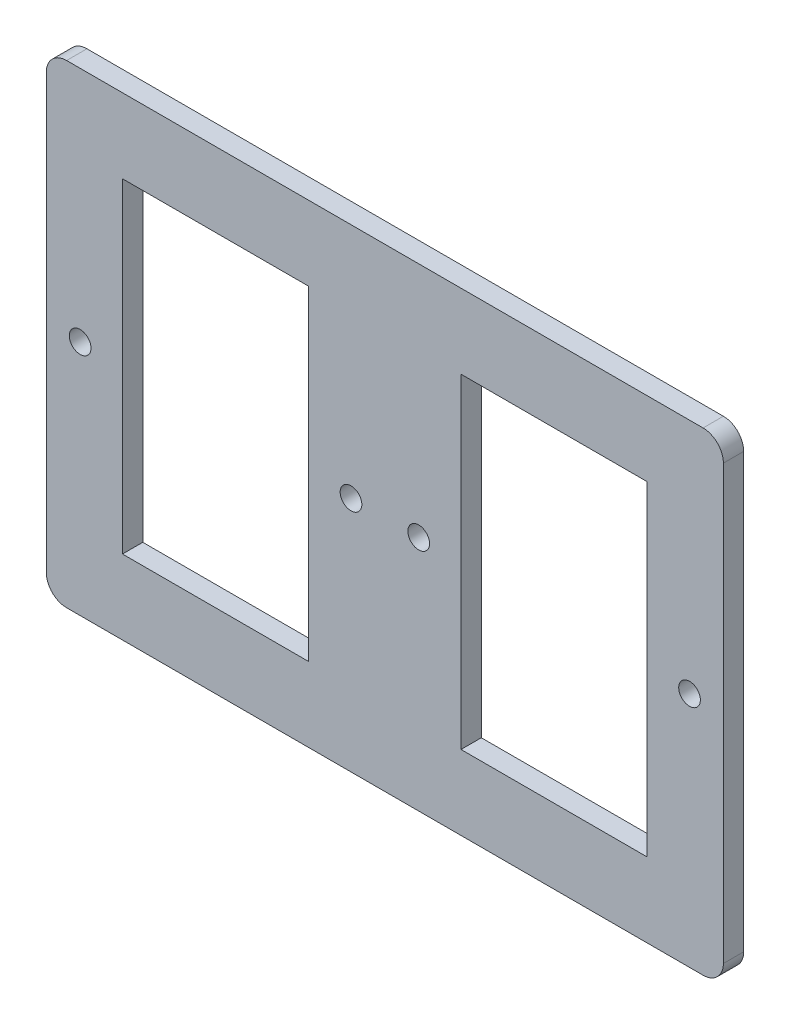
ISO-10303-21;
HEADER;
FILE_DESCRIPTION(('STEP AP214'),'2;1');
FILE_NAME('part.step','',(''),(''),'','','');
FILE_SCHEMA(('AUTOMOTIVE_DESIGN { 1 0 10303 214 1 1 1 1 }'));
ENDSEC;
DATA;
#1=APPLICATION_CONTEXT('core data for automotive mechanical design processes');
#2=APPLICATION_PROTOCOL_DEFINITION('international standard','automotive_design',2000,#1);
#3=PRODUCT_CONTEXT('',#1,'mechanical');
#4=PRODUCT('Part','Part','',(#3));
#5=PRODUCT_RELATED_PRODUCT_CATEGORY('part','',(#4));
#6=PRODUCT_DEFINITION_FORMATION('','',#4);
#7=PRODUCT_DEFINITION_CONTEXT('part definition',#1,'design');
#8=PRODUCT_DEFINITION('design','',#6,#7);
#9=PRODUCT_DEFINITION_SHAPE('','',#8);
#10=(LENGTH_UNIT() NAMED_UNIT(*) SI_UNIT(.MILLI.,.METRE.));
#11=(NAMED_UNIT(*) PLANE_ANGLE_UNIT() SI_UNIT($,.RADIAN.));
#12=(NAMED_UNIT(*) SI_UNIT($,.STERADIAN.) SOLID_ANGLE_UNIT());
#13=UNCERTAINTY_MEASURE_WITH_UNIT(LENGTH_MEASURE(1.E-05),#10,'distance_accuracy_value','');
#14=(GEOMETRIC_REPRESENTATION_CONTEXT(3) GLOBAL_UNCERTAINTY_ASSIGNED_CONTEXT((#13)) GLOBAL_UNIT_ASSIGNED_CONTEXT((#10,
#11,#12)) REPRESENTATION_CONTEXT('',''));
#15=CARTESIAN_POINT('',(0.,0.,0.));
#16=DIRECTION('',(0.,0.,1.));
#17=DIRECTION('',(1.,0.,0.));
#18=AXIS2_PLACEMENT_3D('',#15,#16,#17);
#19=CARTESIAN_POINT('',(0.,0.,3.));
#20=DIRECTION('',(0.,0.,1.));
#21=DIRECTION('',(1.,0.,0.));
#22=AXIS2_PLACEMENT_3D('',#19,#20,#21);
#23=PLANE('',#22);
#24=CARTESIAN_POINT('',(-45.,0.,3.));
#25=DIRECTION('',(0.,0.,1.));
#26=DIRECTION('',(1.,0.,0.));
#27=AXIS2_PLACEMENT_3D('',#24,#25,#26);
#28=CIRCLE('',#27,1.6);
#29=CARTESIAN_POINT('',(-43.4,0.,3.));
#30=VERTEX_POINT('',#29);
#31=EDGE_CURVE('E588',#30,#30,#28,.T.);
#32=ORIENTED_EDGE('',*,*,#31,.F.);
#33=EDGE_LOOP('',(#32));
#34=FACE_BOUND('',#33,.T.);
#35=CARTESIAN_POINT('',(-5.,0.,3.));
#36=DIRECTION('',(0.,0.,1.));
#37=DIRECTION('',(1.,0.,0.));
#38=AXIS2_PLACEMENT_3D('',#35,#36,#37);
#39=CIRCLE('',#38,1.6);
#40=CARTESIAN_POINT('',(-3.40000000000001,0.,3.));
#41=VERTEX_POINT('',#40);
#42=EDGE_CURVE('E582',#41,#41,#39,.T.);
#43=ORIENTED_EDGE('',*,*,#42,.F.);
#44=EDGE_LOOP('',(#43));
#45=FACE_BOUND('',#44,.T.);
#46=CARTESIAN_POINT('',(45.,0.,3.));
#47=DIRECTION('',(0.,0.,1.));
#48=DIRECTION('',(1.,0.,0.));
#49=AXIS2_PLACEMENT_3D('',#46,#47,#48);
#50=CIRCLE('',#49,1.6);
#51=CARTESIAN_POINT('',(46.6,0.,3.));
#52=VERTEX_POINT('',#51);
#53=EDGE_CURVE('E574',#52,#52,#50,.T.);
#54=ORIENTED_EDGE('',*,*,#53,.F.);
#55=EDGE_LOOP('',(#54));
#56=FACE_BOUND('',#55,.T.);
#57=CARTESIAN_POINT('',(5.,0.,3.));
#58=DIRECTION('',(0.,0.,1.));
#59=DIRECTION('',(1.,0.,0.));
#60=AXIS2_PLACEMENT_3D('',#57,#58,#59);
#61=CIRCLE('',#60,1.6);
#62=CARTESIAN_POINT('',(6.6,0.,3.));
#63=VERTEX_POINT('',#62);
#64=EDGE_CURVE('E569',#63,#63,#61,.T.);
#65=ORIENTED_EDGE('',*,*,#64,.F.);
#66=EDGE_LOOP('',(#65));
#67=FACE_BOUND('',#66,.T.);
#68=DIRECTION('',(0.,1.,0.));
#69=VECTOR('',#68,1.);
#70=CARTESIAN_POINT('',(50.,-35.,3.));
#71=LINE('',#70,#69);
#72=CARTESIAN_POINT('',(50.,-32.,3.));
#73=VERTEX_POINT('',#72);
#74=CARTESIAN_POINT('',(50.,32.,3.));
#75=VERTEX_POINT('',#74);
#76=EDGE_CURVE('E231',#73,#75,#71,.T.);
#77=ORIENTED_EDGE('',*,*,#76,.T.);
#78=CARTESIAN_POINT('',(47.,32.,3.));
#79=DIRECTION('',(0.,0.,1.));
#80=DIRECTION('',(1.,0.,0.));
#81=AXIS2_PLACEMENT_3D('',#78,#79,#80);
#82=CIRCLE('',#81,3.);
#83=CARTESIAN_POINT('',(47.,35.,3.));
#84=VERTEX_POINT('',#83);
#85=EDGE_CURVE('E269',#75,#84,#82,.T.);
#86=ORIENTED_EDGE('',*,*,#85,.T.);
#87=DIRECTION('',(-1.,0.,0.));
#88=VECTOR('',#87,1.);
#89=CARTESIAN_POINT('',(50.,35.,3.));
#90=LINE('',#89,#88);
#91=CARTESIAN_POINT('',(-47.,35.,3.));
#92=VERTEX_POINT('',#91);
#93=EDGE_CURVE('E234',#84,#92,#90,.T.);
#94=ORIENTED_EDGE('',*,*,#93,.T.);
#95=CARTESIAN_POINT('',(-47.,32.,3.));
#96=DIRECTION('',(0.,0.,1.));
#97=DIRECTION('',(1.,0.,0.));
#98=AXIS2_PLACEMENT_3D('',#95,#96,#97);
#99=CIRCLE('',#98,3.);
#100=CARTESIAN_POINT('',(-50.,32.,3.));
#101=VERTEX_POINT('',#100);
#102=EDGE_CURVE('E264',#92,#101,#99,.T.);
#103=ORIENTED_EDGE('',*,*,#102,.T.);
#104=DIRECTION('',(0.,-1.,0.));
#105=VECTOR('',#104,1.);
#106=CARTESIAN_POINT('',(-50.,-35.,3.));
#107=LINE('',#106,#105);
#108=CARTESIAN_POINT('',(-50.,-32.,3.));
#109=VERTEX_POINT('',#108);
#110=EDGE_CURVE('E226',#101,#109,#107,.T.);
#111=ORIENTED_EDGE('',*,*,#110,.T.);
#112=CARTESIAN_POINT('',(-47.,-32.,3.));
#113=DIRECTION('',(0.,0.,1.));
#114=DIRECTION('',(1.,0.,0.));
#115=AXIS2_PLACEMENT_3D('',#112,#113,#114);
#116=CIRCLE('',#115,3.);
#117=CARTESIAN_POINT('',(-47.,-35.,3.));
#118=VERTEX_POINT('',#117);
#119=EDGE_CURVE('E59',#109,#118,#116,.T.);
#120=ORIENTED_EDGE('',*,*,#119,.T.);
#121=DIRECTION('',(1.,0.,0.));
#122=VECTOR('',#121,1.);
#123=CARTESIAN_POINT('',(50.,-35.,3.));
#124=LINE('',#123,#122);
#125=CARTESIAN_POINT('',(47.,-35.,3.));
#126=VERTEX_POINT('',#125);
#127=EDGE_CURVE('E228',#118,#126,#124,.T.);
#128=ORIENTED_EDGE('',*,*,#127,.T.);
#129=CARTESIAN_POINT('',(47.,-32.,3.));
#130=DIRECTION('',(0.,0.,1.));
#131=DIRECTION('',(1.,0.,0.));
#132=AXIS2_PLACEMENT_3D('',#129,#130,#131);
#133=CIRCLE('',#132,3.);
#134=EDGE_CURVE('E267',#126,#73,#133,.T.);
#135=ORIENTED_EDGE('',*,*,#134,.T.);
#136=EDGE_LOOP('',(#77,#86,#94,#103,#111,#120,#128,#135));
#137=FACE_BOUND('',#136,.T.);
#138=DIRECTION('',(1.,0.,0.));
#139=VECTOR('',#138,1.);
#140=CARTESIAN_POINT('',(-11.25,-24.,3.));
#141=LINE('',#140,#139);
#142=CARTESIAN_POINT('',(-38.75,-24.,3.));
#143=VERTEX_POINT('',#142);
#144=CARTESIAN_POINT('',(-11.25,-24.,3.));
#145=VERTEX_POINT('',#144);
#146=EDGE_CURVE('E197',#143,#145,#141,.T.);
#147=ORIENTED_EDGE('',*,*,#146,.F.);
#148=DIRECTION('',(0.,-1.,0.));
#149=VECTOR('',#148,1.);
#150=CARTESIAN_POINT('',(-38.75,-24.,3.));
#151=LINE('',#150,#149);
#152=CARTESIAN_POINT('',(-38.75,24.,3.));
#153=VERTEX_POINT('',#152);
#154=EDGE_CURVE('E195',#153,#143,#151,.T.);
#155=ORIENTED_EDGE('',*,*,#154,.F.);
#156=DIRECTION('',(-1.,0.,0.));
#157=VECTOR('',#156,1.);
#158=CARTESIAN_POINT('',(-11.25,24.,3.));
#159=LINE('',#158,#157);
#160=CARTESIAN_POINT('',(-11.25,24.,3.));
#161=VERTEX_POINT('',#160);
#162=EDGE_CURVE('E203',#161,#153,#159,.T.);
#163=ORIENTED_EDGE('',*,*,#162,.F.);
#164=DIRECTION('',(0.,1.,0.));
#165=VECTOR('',#164,1.);
#166=CARTESIAN_POINT('',(-11.25,-24.,3.));
#167=LINE('',#166,#165);
#168=EDGE_CURVE('E200',#145,#161,#167,.T.);
#169=ORIENTED_EDGE('',*,*,#168,.F.);
#170=EDGE_LOOP('',(#147,#155,#163,#169));
#171=FACE_BOUND('',#170,.T.);
#172=DIRECTION('',(1.,0.,0.));
#173=VECTOR('',#172,1.);
#174=CARTESIAN_POINT('',(11.25,-24.,3.));
#175=LINE('',#174,#173);
#176=CARTESIAN_POINT('',(11.25,-24.,3.));
#177=VERTEX_POINT('',#176);
#178=CARTESIAN_POINT('',(38.75,-24.,3.));
#179=VERTEX_POINT('',#178);
#180=EDGE_CURVE('E162',#177,#179,#175,.T.);
#181=ORIENTED_EDGE('',*,*,#180,.F.);
#182=DIRECTION('',(0.,-1.,0.));
#183=VECTOR('',#182,1.);
#184=CARTESIAN_POINT('',(11.25,-24.,3.));
#185=LINE('',#184,#183);
#186=CARTESIAN_POINT('',(11.25,24.,3.));
#187=VERTEX_POINT('',#186);
#188=EDGE_CURVE('E152',#187,#177,#185,.T.);
#189=ORIENTED_EDGE('',*,*,#188,.F.);
#190=DIRECTION('',(-1.,0.,0.));
#191=VECTOR('',#190,1.);
#192=CARTESIAN_POINT('',(11.25,24.,3.));
#193=LINE('',#192,#191);
#194=CARTESIAN_POINT('',(38.75,24.,3.));
#195=VERTEX_POINT('',#194);
#196=EDGE_CURVE('E177',#195,#187,#193,.T.);
#197=ORIENTED_EDGE('',*,*,#196,.F.);
#198=DIRECTION('',(0.,1.,0.));
#199=VECTOR('',#198,1.);
#200=CARTESIAN_POINT('',(38.75,-24.,3.));
#201=LINE('',#200,#199);
#202=EDGE_CURVE('E175',#179,#195,#201,.T.);
#203=ORIENTED_EDGE('',*,*,#202,.F.);
#204=EDGE_LOOP('',(#181,#189,#197,#203));
#205=FACE_BOUND('',#204,.T.);
#206=ADVANCED_FACE('F37',(#34,#45,#56,#67,#137,#171,#205),#23,.T.);
#207=CARTESIAN_POINT('',(0.,0.,0.));
#208=DIRECTION('',(0.,0.,1.));
#209=DIRECTION('',(1.,0.,0.));
#210=AXIS2_PLACEMENT_3D('',#207,#208,#209);
#211=PLANE('',#210);
#212=CARTESIAN_POINT('',(-45.,0.,0.));
#213=DIRECTION('',(0.,0.,1.));
#214=DIRECTION('',(1.,0.,0.));
#215=AXIS2_PLACEMENT_3D('',#212,#213,#214);
#216=CIRCLE('',#215,1.6);
#217=CARTESIAN_POINT('',(-43.4,0.,0.));
#218=VERTEX_POINT('',#217);
#219=EDGE_CURVE('E585',#218,#218,#216,.T.);
#220=ORIENTED_EDGE('',*,*,#219,.T.);
#221=EDGE_LOOP('',(#220));
#222=FACE_BOUND('',#221,.T.);
#223=CARTESIAN_POINT('',(-5.,0.,0.));
#224=DIRECTION('',(0.,0.,1.));
#225=DIRECTION('',(1.,0.,0.));
#226=AXIS2_PLACEMENT_3D('',#223,#224,#225);
#227=CIRCLE('',#226,1.6);
#228=CARTESIAN_POINT('',(-3.40000000000001,0.,0.));
#229=VERTEX_POINT('',#228);
#230=EDGE_CURVE('E579',#229,#229,#227,.T.);
#231=ORIENTED_EDGE('',*,*,#230,.T.);
#232=EDGE_LOOP('',(#231));
#233=FACE_BOUND('',#232,.T.);
#234=CARTESIAN_POINT('',(45.,0.,0.));
#235=DIRECTION('',(0.,0.,1.));
#236=DIRECTION('',(1.,0.,0.));
#237=AXIS2_PLACEMENT_3D('',#234,#235,#236);
#238=CIRCLE('',#237,1.6);
#239=CARTESIAN_POINT('',(46.6,0.,0.));
#240=VERTEX_POINT('',#239);
#241=EDGE_CURVE('E571',#240,#240,#238,.T.);
#242=ORIENTED_EDGE('',*,*,#241,.T.);
#243=EDGE_LOOP('',(#242));
#244=FACE_BOUND('',#243,.T.);
#245=CARTESIAN_POINT('',(5.,0.,0.));
#246=DIRECTION('',(0.,0.,1.));
#247=DIRECTION('',(1.,0.,0.));
#248=AXIS2_PLACEMENT_3D('',#245,#246,#247);
#249=CIRCLE('',#248,1.6);
#250=CARTESIAN_POINT('',(6.6,0.,0.));
#251=VERTEX_POINT('',#250);
#252=EDGE_CURVE('E184',#251,#251,#249,.T.);
#253=ORIENTED_EDGE('',*,*,#252,.T.);
#254=EDGE_LOOP('',(#253));
#255=FACE_BOUND('',#254,.T.);
#256=DIRECTION('',(0.,-1.,0.));
#257=VECTOR('',#256,1.);
#258=CARTESIAN_POINT('',(-38.75,-24.,0.));
#259=LINE('',#258,#257);
#260=CARTESIAN_POINT('',(-38.75,24.,0.));
#261=VERTEX_POINT('',#260);
#262=CARTESIAN_POINT('',(-38.75,-24.,0.));
#263=VERTEX_POINT('',#262);
#264=EDGE_CURVE('E170',#261,#263,#259,.T.);
#265=ORIENTED_EDGE('',*,*,#264,.T.);
#266=DIRECTION('',(1.,0.,0.));
#267=VECTOR('',#266,1.);
#268=CARTESIAN_POINT('',(-11.25,-24.,0.));
#269=LINE('',#268,#267);
#270=CARTESIAN_POINT('',(-11.25,-24.,0.));
#271=VERTEX_POINT('',#270);
#272=EDGE_CURVE('E208',#263,#271,#269,.T.);
#273=ORIENTED_EDGE('',*,*,#272,.T.);
#274=DIRECTION('',(0.,1.,0.));
#275=VECTOR('',#274,1.);
#276=CARTESIAN_POINT('',(-11.25,-24.,0.));
#277=LINE('',#276,#275);
#278=CARTESIAN_POINT('',(-11.25,24.,0.));
#279=VERTEX_POINT('',#278);
#280=EDGE_CURVE('E211',#271,#279,#277,.T.);
#281=ORIENTED_EDGE('',*,*,#280,.T.);
#282=DIRECTION('',(-1.,0.,0.));
#283=VECTOR('',#282,1.);
#284=CARTESIAN_POINT('',(-11.25,24.,0.));
#285=LINE('',#284,#283);
#286=EDGE_CURVE('E198',#279,#261,#285,.T.);
#287=ORIENTED_EDGE('',*,*,#286,.T.);
#288=EDGE_LOOP('',(#265,#273,#281,#287));
#289=FACE_BOUND('',#288,.T.);
#290=DIRECTION('',(-1.,0.,0.));
#291=VECTOR('',#290,1.);
#292=CARTESIAN_POINT('',(50.,35.,0.));
#293=LINE('',#292,#291);
#294=CARTESIAN_POINT('',(47.,35.,0.));
#295=VERTEX_POINT('',#294);
#296=CARTESIAN_POINT('',(-47.,35.,0.));
#297=VERTEX_POINT('',#296);
#298=EDGE_CURVE('E229',#295,#297,#293,.T.);
#299=ORIENTED_EDGE('',*,*,#298,.F.);
#300=CARTESIAN_POINT('',(47.,32.,0.));
#301=DIRECTION('',(0.,0.,1.));
#302=DIRECTION('',(1.,0.,0.));
#303=AXIS2_PLACEMENT_3D('',#300,#301,#302);
#304=CIRCLE('',#303,3.);
#305=CARTESIAN_POINT('',(50.,32.,0.));
#306=VERTEX_POINT('',#305);
#307=EDGE_CURVE('E257',#295,#306,#304,.F.);
#308=ORIENTED_EDGE('',*,*,#307,.T.);
#309=DIRECTION('',(0.,1.,0.));
#310=VECTOR('',#309,1.);
#311=CARTESIAN_POINT('',(50.,-35.,0.));
#312=LINE('',#311,#310);
#313=CARTESIAN_POINT('',(50.,-32.,0.));
#314=VERTEX_POINT('',#313);
#315=EDGE_CURVE('E242',#314,#306,#312,.T.);
#316=ORIENTED_EDGE('',*,*,#315,.F.);
#317=CARTESIAN_POINT('',(47.,-32.,0.));
#318=DIRECTION('',(0.,0.,1.));
#319=DIRECTION('',(1.,0.,0.));
#320=AXIS2_PLACEMENT_3D('',#317,#318,#319);
#321=CIRCLE('',#320,3.);
#322=CARTESIAN_POINT('',(47.,-35.,0.));
#323=VERTEX_POINT('',#322);
#324=EDGE_CURVE('E255',#314,#323,#321,.F.);
#325=ORIENTED_EDGE('',*,*,#324,.T.);
#326=DIRECTION('',(1.,0.,0.));
#327=VECTOR('',#326,1.);
#328=CARTESIAN_POINT('',(50.,-35.,0.));
#329=LINE('',#328,#327);
#330=CARTESIAN_POINT('',(-47.,-35.,0.));
#331=VERTEX_POINT('',#330);
#332=EDGE_CURVE('E240',#331,#323,#329,.T.);
#333=ORIENTED_EDGE('',*,*,#332,.F.);
#334=CARTESIAN_POINT('',(-47.,-32.,0.));
#335=DIRECTION('',(0.,0.,1.));
#336=DIRECTION('',(1.,0.,0.));
#337=AXIS2_PLACEMENT_3D('',#334,#335,#336);
#338=CIRCLE('',#337,3.);
#339=CARTESIAN_POINT('',(-50.,-32.,0.));
#340=VERTEX_POINT('',#339);
#341=EDGE_CURVE('E253',#331,#340,#338,.F.);
#342=ORIENTED_EDGE('',*,*,#341,.T.);
#343=DIRECTION('',(0.,-1.,0.));
#344=VECTOR('',#343,1.);
#345=CARTESIAN_POINT('',(-50.,-35.,0.));
#346=LINE('',#345,#344);
#347=CARTESIAN_POINT('',(-50.,32.,0.));
#348=VERTEX_POINT('',#347);
#349=EDGE_CURVE('E225',#348,#340,#346,.T.);
#350=ORIENTED_EDGE('',*,*,#349,.F.);
#351=CARTESIAN_POINT('',(-47.,32.,0.));
#352=DIRECTION('',(0.,0.,1.));
#353=DIRECTION('',(1.,0.,0.));
#354=AXIS2_PLACEMENT_3D('',#351,#352,#353);
#355=CIRCLE('',#354,3.);
#356=EDGE_CURVE('E251',#348,#297,#355,.F.);
#357=ORIENTED_EDGE('',*,*,#356,.T.);
#358=EDGE_LOOP('',(#299,#308,#316,#325,#333,#342,#350,#357));
#359=FACE_BOUND('',#358,.T.);
#360=DIRECTION('',(0.,-1.,0.));
#361=VECTOR('',#360,1.);
#362=CARTESIAN_POINT('',(11.25,-24.,0.));
#363=LINE('',#362,#361);
#364=CARTESIAN_POINT('',(11.25,24.,0.));
#365=VERTEX_POINT('',#364);
#366=CARTESIAN_POINT('',(11.25,-24.,0.));
#367=VERTEX_POINT('',#366);
#368=EDGE_CURVE('E182',#365,#367,#363,.T.);
#369=ORIENTED_EDGE('',*,*,#368,.T.);
#370=DIRECTION('',(1.,0.,0.));
#371=VECTOR('',#370,1.);
#372=CARTESIAN_POINT('',(11.25,-24.,0.));
#373=LINE('',#372,#371);
#374=CARTESIAN_POINT('',(38.75,-24.,0.));
#375=VERTEX_POINT('',#374);
#376=EDGE_CURVE('E169',#367,#375,#373,.T.);
#377=ORIENTED_EDGE('',*,*,#376,.T.);
#378=DIRECTION('',(0.,1.,0.));
#379=VECTOR('',#378,1.);
#380=CARTESIAN_POINT('',(38.75,-24.,0.));
#381=LINE('',#380,#379);
#382=CARTESIAN_POINT('',(38.75,24.,0.));
#383=VERTEX_POINT('',#382);
#384=EDGE_CURVE('E186',#375,#383,#381,.T.);
#385=ORIENTED_EDGE('',*,*,#384,.T.);
#386=DIRECTION('',(-1.,0.,0.));
#387=VECTOR('',#386,1.);
#388=CARTESIAN_POINT('',(11.25,24.,0.));
#389=LINE('',#388,#387);
#390=EDGE_CURVE('E163',#383,#365,#389,.T.);
#391=ORIENTED_EDGE('',*,*,#390,.T.);
#392=EDGE_LOOP('',(#369,#377,#385,#391));
#393=FACE_BOUND('',#392,.T.);
#394=ADVANCED_FACE('F285',(#222,#233,#244,#255,#289,#359,#393),#211,.F.);
#395=CARTESIAN_POINT('',(-50.,-35.,3.));
#396=DIRECTION('',(1.,0.,0.));
#397=DIRECTION('',(0.,0.,-1.));
#398=AXIS2_PLACEMENT_3D('',#395,#396,#397);
#399=PLANE('',#398);
#400=ORIENTED_EDGE('',*,*,#349,.T.);
#401=DIRECTION('',(0.,0.,-1.));
#402=VECTOR('',#401,1.);
#403=CARTESIAN_POINT('',(-50.,-32.,3.));
#404=LINE('',#403,#402);
#405=EDGE_CURVE('E11',#340,#109,#404,.F.);
#406=ORIENTED_EDGE('',*,*,#405,.T.);
#407=ORIENTED_EDGE('',*,*,#110,.F.);
#408=DIRECTION('',(0.,0.,-1.));
#409=VECTOR('',#408,1.);
#410=CARTESIAN_POINT('',(-50.,32.,3.));
#411=LINE('',#410,#409);
#412=EDGE_CURVE('E45',#101,#348,#411,.T.);
#413=ORIENTED_EDGE('',*,*,#412,.T.);
#414=EDGE_LOOP('',(#400,#406,#407,#413));
#415=FACE_BOUND('',#414,.T.);
#416=ADVANCED_FACE('F279',(#415),#399,.F.);
#417=CARTESIAN_POINT('',(50.,-35.,3.));
#418=DIRECTION('',(0.,1.,0.));
#419=DIRECTION('',(-1.,0.,0.));
#420=AXIS2_PLACEMENT_3D('',#417,#418,#419);
#421=PLANE('',#420);
#422=ORIENTED_EDGE('',*,*,#332,.T.);
#423=DIRECTION('',(0.,0.,-1.));
#424=VECTOR('',#423,1.);
#425=CARTESIAN_POINT('',(47.,-35.,3.));
#426=LINE('',#425,#424);
#427=EDGE_CURVE('E52',#323,#126,#426,.F.);
#428=ORIENTED_EDGE('',*,*,#427,.T.);
#429=ORIENTED_EDGE('',*,*,#127,.F.);
#430=DIRECTION('',(0.,0.,-1.));
#431=VECTOR('',#430,1.);
#432=CARTESIAN_POINT('',(-47.,-35.,3.));
#433=LINE('',#432,#431);
#434=EDGE_CURVE('E271',#118,#331,#433,.T.);
#435=ORIENTED_EDGE('',*,*,#434,.T.);
#436=EDGE_LOOP('',(#422,#428,#429,#435));
#437=FACE_BOUND('',#436,.T.);
#438=ADVANCED_FACE('F291',(#437),#421,.F.);
#439=CARTESIAN_POINT('',(50.,-35.,3.));
#440=DIRECTION('',(-1.,0.,0.));
#441=DIRECTION('',(0.,0.,1.));
#442=AXIS2_PLACEMENT_3D('',#439,#440,#441);
#443=PLANE('',#442);
#444=ORIENTED_EDGE('',*,*,#315,.T.);
#445=DIRECTION('',(0.,0.,-1.));
#446=VECTOR('',#445,1.);
#447=CARTESIAN_POINT('',(50.,32.,3.));
#448=LINE('',#447,#446);
#449=EDGE_CURVE('E262',#306,#75,#448,.F.);
#450=ORIENTED_EDGE('',*,*,#449,.T.);
#451=ORIENTED_EDGE('',*,*,#76,.F.);
#452=DIRECTION('',(0.,0.,-1.));
#453=VECTOR('',#452,1.);
#454=CARTESIAN_POINT('',(50.,-32.,3.));
#455=LINE('',#454,#453);
#456=EDGE_CURVE('E259',#73,#314,#455,.T.);
#457=ORIENTED_EDGE('',*,*,#456,.T.);
#458=EDGE_LOOP('',(#444,#450,#451,#457));
#459=FACE_BOUND('',#458,.T.);
#460=ADVANCED_FACE('F300',(#459),#443,.F.);
#461=CARTESIAN_POINT('',(50.,35.,3.));
#462=DIRECTION('',(0.,-1.,0.));
#463=DIRECTION('',(1.,0.,0.));
#464=AXIS2_PLACEMENT_3D('',#461,#462,#463);
#465=PLANE('',#464);
#466=ORIENTED_EDGE('',*,*,#93,.F.);
#467=DIRECTION('',(0.,0.,-1.));
#468=VECTOR('',#467,1.);
#469=CARTESIAN_POINT('',(47.,35.,3.));
#470=LINE('',#469,#468);
#471=EDGE_CURVE('E248',#84,#295,#470,.T.);
#472=ORIENTED_EDGE('',*,*,#471,.T.);
#473=ORIENTED_EDGE('',*,*,#298,.T.);
#474=DIRECTION('',(0.,0.,-1.));
#475=VECTOR('',#474,1.);
#476=CARTESIAN_POINT('',(-47.,35.,3.));
#477=LINE('',#476,#475);
#478=EDGE_CURVE('E237',#297,#92,#477,.F.);
#479=ORIENTED_EDGE('',*,*,#478,.T.);
#480=EDGE_LOOP('',(#466,#472,#473,#479));
#481=FACE_BOUND('',#480,.T.);
#482=ADVANCED_FACE('F308',(#481),#465,.F.);
#483=CARTESIAN_POINT('',(-38.75,-24.,3.));
#484=DIRECTION('',(1.,0.,0.));
#485=DIRECTION('',(0.,0.,-1.));
#486=AXIS2_PLACEMENT_3D('',#483,#484,#485);
#487=PLANE('',#486);
#488=ORIENTED_EDGE('',*,*,#264,.F.);
#489=DIRECTION('',(0.,0.,-1.));
#490=VECTOR('',#489,1.);
#491=CARTESIAN_POINT('',(-38.75,24.,3.));
#492=LINE('',#491,#490);
#493=EDGE_CURVE('E205',#153,#261,#492,.T.);
#494=ORIENTED_EDGE('',*,*,#493,.F.);
#495=ORIENTED_EDGE('',*,*,#154,.T.);
#496=DIRECTION('',(0.,0.,-1.));
#497=VECTOR('',#496,1.);
#498=CARTESIAN_POINT('',(-38.75,-24.,3.));
#499=LINE('',#498,#497);
#500=EDGE_CURVE('E222',#143,#263,#499,.T.);
#501=ORIENTED_EDGE('',*,*,#500,.T.);
#502=EDGE_LOOP('',(#488,#494,#495,#501));
#503=FACE_BOUND('',#502,.T.);
#504=ADVANCED_FACE('F325',(#503),#487,.T.);
#505=CARTESIAN_POINT('',(-11.25,-24.,3.));
#506=DIRECTION('',(0.,1.,0.));
#507=DIRECTION('',(-1.,0.,0.));
#508=AXIS2_PLACEMENT_3D('',#505,#506,#507);
#509=PLANE('',#508);
#510=ORIENTED_EDGE('',*,*,#272,.F.);
#511=ORIENTED_EDGE('',*,*,#500,.F.);
#512=ORIENTED_EDGE('',*,*,#146,.T.);
#513=DIRECTION('',(0.,0.,-1.));
#514=VECTOR('',#513,1.);
#515=CARTESIAN_POINT('',(-11.25,-24.,3.));
#516=LINE('',#515,#514);
#517=EDGE_CURVE('E220',#145,#271,#516,.T.);
#518=ORIENTED_EDGE('',*,*,#517,.T.);
#519=EDGE_LOOP('',(#510,#511,#512,#518));
#520=FACE_BOUND('',#519,.T.);
#521=ADVANCED_FACE('F460',(#520),#509,.T.);
#522=CARTESIAN_POINT('',(-11.25,-24.,3.));
#523=DIRECTION('',(-1.,0.,0.));
#524=DIRECTION('',(0.,0.,1.));
#525=AXIS2_PLACEMENT_3D('',#522,#523,#524);
#526=PLANE('',#525);
#527=ORIENTED_EDGE('',*,*,#280,.F.);
#528=ORIENTED_EDGE('',*,*,#517,.F.);
#529=ORIENTED_EDGE('',*,*,#168,.T.);
#530=DIRECTION('',(0.,0.,-1.));
#531=VECTOR('',#530,1.);
#532=CARTESIAN_POINT('',(-11.25,24.,3.));
#533=LINE('',#532,#531);
#534=EDGE_CURVE('E218',#161,#279,#533,.T.);
#535=ORIENTED_EDGE('',*,*,#534,.T.);
#536=EDGE_LOOP('',(#527,#528,#529,#535));
#537=FACE_BOUND('',#536,.T.);
#538=ADVANCED_FACE('F450',(#537),#526,.T.);
#539=CARTESIAN_POINT('',(-11.25,24.,3.));
#540=DIRECTION('',(0.,-1.,0.));
#541=DIRECTION('',(0.,0.,-1.));
#542=AXIS2_PLACEMENT_3D('',#539,#540,#541);
#543=PLANE('',#542);
#544=ORIENTED_EDGE('',*,*,#286,.F.);
#545=ORIENTED_EDGE('',*,*,#534,.F.);
#546=ORIENTED_EDGE('',*,*,#162,.T.);
#547=ORIENTED_EDGE('',*,*,#493,.T.);
#548=EDGE_LOOP('',(#544,#545,#546,#547));
#549=FACE_BOUND('',#548,.T.);
#550=ADVANCED_FACE('F441',(#549),#543,.T.);
#551=CARTESIAN_POINT('',(11.25,-24.,3.));
#552=DIRECTION('',(1.,0.,0.));
#553=DIRECTION('',(0.,0.,-1.));
#554=AXIS2_PLACEMENT_3D('',#551,#552,#553);
#555=PLANE('',#554);
#556=ORIENTED_EDGE('',*,*,#368,.F.);
#557=DIRECTION('',(0.,0.,-1.));
#558=VECTOR('',#557,1.);
#559=CARTESIAN_POINT('',(11.25,24.,3.));
#560=LINE('',#559,#558);
#561=EDGE_CURVE('E158',#187,#365,#560,.T.);
#562=ORIENTED_EDGE('',*,*,#561,.F.);
#563=ORIENTED_EDGE('',*,*,#188,.T.);
#564=DIRECTION('',(0.,0.,-1.));
#565=VECTOR('',#564,1.);
#566=CARTESIAN_POINT('',(11.25,-24.,3.));
#567=LINE('',#566,#565);
#568=EDGE_CURVE('E155',#177,#367,#567,.T.);
#569=ORIENTED_EDGE('',*,*,#568,.T.);
#570=EDGE_LOOP('',(#556,#562,#563,#569));
#571=FACE_BOUND('',#570,.T.);
#572=ADVANCED_FACE('F154',(#571),#555,.T.);
#573=CARTESIAN_POINT('',(11.25,-24.,3.));
#574=DIRECTION('',(0.,1.,0.));
#575=DIRECTION('',(-1.,0.,0.));
#576=AXIS2_PLACEMENT_3D('',#573,#574,#575);
#577=PLANE('',#576);
#578=ORIENTED_EDGE('',*,*,#376,.F.);
#579=ORIENTED_EDGE('',*,*,#568,.F.);
#580=ORIENTED_EDGE('',*,*,#180,.T.);
#581=DIRECTION('',(0.,0.,-1.));
#582=VECTOR('',#581,1.);
#583=CARTESIAN_POINT('',(38.75,-24.,3.));
#584=LINE('',#583,#582);
#585=EDGE_CURVE('E171',#179,#375,#584,.T.);
#586=ORIENTED_EDGE('',*,*,#585,.T.);
#587=EDGE_LOOP('',(#578,#579,#580,#586));
#588=FACE_BOUND('',#587,.T.);
#589=ADVANCED_FACE('F166',(#588),#577,.T.);
#590=CARTESIAN_POINT('',(38.75,-24.,3.));
#591=DIRECTION('',(-1.,0.,0.));
#592=DIRECTION('',(0.,0.,1.));
#593=AXIS2_PLACEMENT_3D('',#590,#591,#592);
#594=PLANE('',#593);
#595=ORIENTED_EDGE('',*,*,#384,.F.);
#596=ORIENTED_EDGE('',*,*,#585,.F.);
#597=ORIENTED_EDGE('',*,*,#202,.T.);
#598=DIRECTION('',(0.,0.,-1.));
#599=VECTOR('',#598,1.);
#600=CARTESIAN_POINT('',(38.75,24.,3.));
#601=LINE('',#600,#599);
#602=EDGE_CURVE('E192',#195,#383,#601,.T.);
#603=ORIENTED_EDGE('',*,*,#602,.T.);
#604=EDGE_LOOP('',(#595,#596,#597,#603));
#605=FACE_BOUND('',#604,.T.);
#606=ADVANCED_FACE('F414',(#605),#594,.T.);
#607=CARTESIAN_POINT('',(11.25,24.,3.));
#608=DIRECTION('',(0.,-1.,0.));
#609=DIRECTION('',(0.,0.,-1.));
#610=AXIS2_PLACEMENT_3D('',#607,#608,#609);
#611=PLANE('',#610);
#612=ORIENTED_EDGE('',*,*,#390,.F.);
#613=ORIENTED_EDGE('',*,*,#602,.F.);
#614=ORIENTED_EDGE('',*,*,#196,.T.);
#615=ORIENTED_EDGE('',*,*,#561,.T.);
#616=EDGE_LOOP('',(#612,#613,#614,#615));
#617=FACE_BOUND('',#616,.T.);
#618=ADVANCED_FACE('F404',(#617),#611,.T.);
#619=CARTESIAN_POINT('',(5.,0.,3.));
#620=DIRECTION('',(0.,0.,1.));
#621=DIRECTION('',(1.,0.,0.));
#622=AXIS2_PLACEMENT_3D('',#619,#620,#621);
#623=CYLINDRICAL_SURFACE('',#622,1.6);
#624=ORIENTED_EDGE('',*,*,#252,.F.);
#625=EDGE_LOOP('',(#624));
#626=FACE_BOUND('',#625,.T.);
#627=ORIENTED_EDGE('',*,*,#64,.T.);
#628=EDGE_LOOP('',(#627));
#629=FACE_BOUND('',#628,.T.);
#630=ADVANCED_FACE('F394',(#626,#629),#623,.F.);
#631=CARTESIAN_POINT('',(45.,0.,3.));
#632=DIRECTION('',(0.,0.,1.));
#633=DIRECTION('',(1.,0.,0.));
#634=AXIS2_PLACEMENT_3D('',#631,#632,#633);
#635=CYLINDRICAL_SURFACE('',#634,1.6);
#636=ORIENTED_EDGE('',*,*,#241,.F.);
#637=EDGE_LOOP('',(#636));
#638=FACE_BOUND('',#637,.T.);
#639=ORIENTED_EDGE('',*,*,#53,.T.);
#640=EDGE_LOOP('',(#639));
#641=FACE_BOUND('',#640,.T.);
#642=ADVANCED_FACE('F384',(#638,#641),#635,.F.);
#643=CARTESIAN_POINT('',(-5.,0.,3.));
#644=DIRECTION('',(0.,0.,1.));
#645=DIRECTION('',(1.,0.,0.));
#646=AXIS2_PLACEMENT_3D('',#643,#644,#645);
#647=CYLINDRICAL_SURFACE('',#646,1.6);
#648=ORIENTED_EDGE('',*,*,#230,.F.);
#649=EDGE_LOOP('',(#648));
#650=FACE_BOUND('',#649,.T.);
#651=ORIENTED_EDGE('',*,*,#42,.T.);
#652=EDGE_LOOP('',(#651));
#653=FACE_BOUND('',#652,.T.);
#654=ADVANCED_FACE('F374',(#650,#653),#647,.F.);
#655=CARTESIAN_POINT('',(-45.,0.,3.));
#656=DIRECTION('',(0.,0.,1.));
#657=DIRECTION('',(1.,0.,0.));
#658=AXIS2_PLACEMENT_3D('',#655,#656,#657);
#659=CYLINDRICAL_SURFACE('',#658,1.6);
#660=ORIENTED_EDGE('',*,*,#219,.F.);
#661=EDGE_LOOP('',(#660));
#662=FACE_BOUND('',#661,.T.);
#663=ORIENTED_EDGE('',*,*,#31,.T.);
#664=EDGE_LOOP('',(#663));
#665=FACE_BOUND('',#664,.T.);
#666=ADVANCED_FACE('F338',(#662,#665),#659,.F.);
#667=CARTESIAN_POINT('',(47.,32.,3.));
#668=DIRECTION('',(0.,0.,-1.));
#669=DIRECTION('',(-1.,0.,0.));
#670=AXIS2_PLACEMENT_3D('',#667,#668,#669);
#671=CYLINDRICAL_SURFACE('',#670,3.);
#672=ORIENTED_EDGE('',*,*,#85,.F.);
#673=ORIENTED_EDGE('',*,*,#449,.F.);
#674=ORIENTED_EDGE('',*,*,#307,.F.);
#675=ORIENTED_EDGE('',*,*,#471,.F.);
#676=EDGE_LOOP('',(#672,#673,#674,#675));
#677=FACE_BOUND('',#676,.T.);
#678=ADVANCED_FACE('F305',(#677),#671,.T.);
#679=CARTESIAN_POINT('',(47.,-32.,3.));
#680=DIRECTION('',(0.,0.,-1.));
#681=DIRECTION('',(-1.,0.,0.));
#682=AXIS2_PLACEMENT_3D('',#679,#680,#681);
#683=CYLINDRICAL_SURFACE('',#682,3.);
#684=ORIENTED_EDGE('',*,*,#134,.F.);
#685=ORIENTED_EDGE('',*,*,#427,.F.);
#686=ORIENTED_EDGE('',*,*,#324,.F.);
#687=ORIENTED_EDGE('',*,*,#456,.F.);
#688=EDGE_LOOP('',(#684,#685,#686,#687));
#689=FACE_BOUND('',#688,.T.);
#690=ADVANCED_FACE('F297',(#689),#683,.T.);
#691=CARTESIAN_POINT('',(-47.,-32.,3.));
#692=DIRECTION('',(0.,0.,-1.));
#693=DIRECTION('',(-1.,0.,0.));
#694=AXIS2_PLACEMENT_3D('',#691,#692,#693);
#695=CYLINDRICAL_SURFACE('',#694,3.);
#696=ORIENTED_EDGE('',*,*,#119,.F.);
#697=ORIENTED_EDGE('',*,*,#405,.F.);
#698=ORIENTED_EDGE('',*,*,#341,.F.);
#699=ORIENTED_EDGE('',*,*,#434,.F.);
#700=EDGE_LOOP('',(#696,#697,#698,#699));
#701=FACE_BOUND('',#700,.T.);
#702=ADVANCED_FACE('F290',(#701),#695,.T.);
#703=CARTESIAN_POINT('',(-47.,32.,3.));
#704=DIRECTION('',(0.,0.,-1.));
#705=DIRECTION('',(-1.,0.,0.));
#706=AXIS2_PLACEMENT_3D('',#703,#704,#705);
#707=CYLINDRICAL_SURFACE('',#706,3.);
#708=ORIENTED_EDGE('',*,*,#102,.F.);
#709=ORIENTED_EDGE('',*,*,#478,.F.);
#710=ORIENTED_EDGE('',*,*,#356,.F.);
#711=ORIENTED_EDGE('',*,*,#412,.F.);
#712=EDGE_LOOP('',(#708,#709,#710,#711));
#713=FACE_BOUND('',#712,.T.);
#714=ADVANCED_FACE('F39',(#713),#707,.T.);
#715=CLOSED_SHELL('',(#206,#394,#416,#438,#460,#482,#504,#521,#538,#550,#572,#589,#606,#618,
#630,#642,#654,#666,#678,#690,#702,#714));
#716=MANIFOLD_SOLID_BREP('B2',#715);
#717=ADVANCED_BREP_SHAPE_REPRESENTATION('',(#18,#716),#14);
#718=SHAPE_DEFINITION_REPRESENTATION(#9,#717);
ENDSEC;
END-ISO-10303-21;
